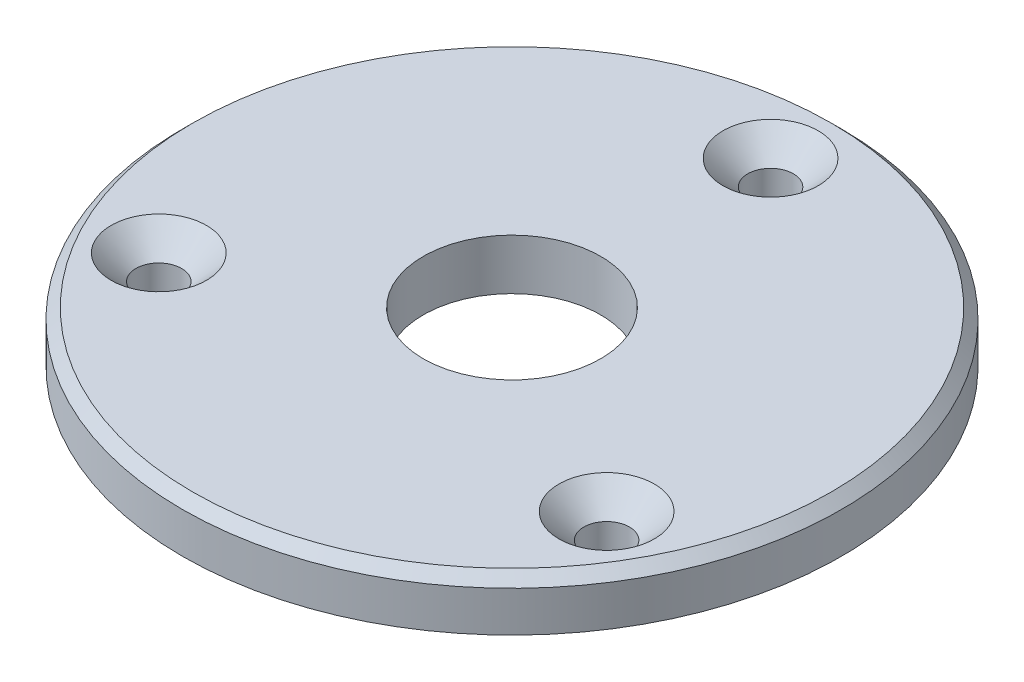
ISO-10303-21;
HEADER;
FILE_DESCRIPTION(('STEP AP214'),'2;1');
FILE_NAME('part.step','',(''),(''),'','','');
FILE_SCHEMA(('AUTOMOTIVE_DESIGN { 1 0 10303 214 1 1 1 1 }'));
ENDSEC;
DATA;
#1=APPLICATION_CONTEXT('core data for automotive mechanical design processes');
#2=APPLICATION_PROTOCOL_DEFINITION('international standard','automotive_design',2000,#1);
#3=PRODUCT_CONTEXT('',#1,'mechanical');
#4=PRODUCT('Part','Part','',(#3));
#5=PRODUCT_RELATED_PRODUCT_CATEGORY('part','',(#4));
#6=PRODUCT_DEFINITION_FORMATION('','',#4);
#7=PRODUCT_DEFINITION_CONTEXT('part definition',#1,'design');
#8=PRODUCT_DEFINITION('design','',#6,#7);
#9=PRODUCT_DEFINITION_SHAPE('','',#8);
#10=(LENGTH_UNIT() NAMED_UNIT(*) SI_UNIT(.MILLI.,.METRE.));
#11=(NAMED_UNIT(*) PLANE_ANGLE_UNIT() SI_UNIT($,.RADIAN.));
#12=(NAMED_UNIT(*) SI_UNIT($,.STERADIAN.) SOLID_ANGLE_UNIT());
#13=UNCERTAINTY_MEASURE_WITH_UNIT(LENGTH_MEASURE(1.E-05),#10,'distance_accuracy_value','');
#14=(GEOMETRIC_REPRESENTATION_CONTEXT(3) GLOBAL_UNCERTAINTY_ASSIGNED_CONTEXT((#13)) GLOBAL_UNIT_ASSIGNED_CONTEXT((#10,
#11,#12)) REPRESENTATION_CONTEXT('',''));
#15=CARTESIAN_POINT('',(0.,0.,0.));
#16=DIRECTION('',(0.,0.,1.));
#17=DIRECTION('',(1.,0.,0.));
#18=AXIS2_PLACEMENT_3D('',#15,#16,#17);
#19=CARTESIAN_POINT('',(0.,5.,0.));
#20=DIRECTION('',(0.,-1.,0.));
#21=DIRECTION('',(0.,0.,-1.));
#22=AXIS2_PLACEMENT_3D('',#19,#20,#21);
#23=CYLINDRICAL_SURFACE('',#22,32.5);
#24=CARTESIAN_POINT('',(0.,3.99999999999998,0.));
#25=DIRECTION('',(0.,1.,0.));
#26=DIRECTION('',(0.,0.,1.));
#27=AXIS2_PLACEMENT_3D('',#24,#25,#26);
#28=CIRCLE('',#27,32.5);
#29=CARTESIAN_POINT('',(0.,3.99999999999998,32.5));
#30=VERTEX_POINT('',#29);
#31=EDGE_CURVE('E10',#30,#30,#28,.F.);
#32=ORIENTED_EDGE('',*,*,#31,.T.);
#33=EDGE_LOOP('',(#32));
#34=FACE_BOUND('',#33,.T.);
#35=CARTESIAN_POINT('',(0.,0.,0.));
#36=DIRECTION('',(0.,1.,0.));
#37=DIRECTION('',(0.,0.,1.));
#38=AXIS2_PLACEMENT_3D('',#35,#36,#37);
#39=CIRCLE('',#38,32.5);
#40=CARTESIAN_POINT('',(0.,0.,32.5));
#41=VERTEX_POINT('',#40);
#42=EDGE_CURVE('E45',#41,#41,#39,.T.);
#43=ORIENTED_EDGE('',*,*,#42,.T.);
#44=EDGE_LOOP('',(#43));
#45=FACE_BOUND('',#44,.T.);
#46=ADVANCED_FACE('F34',(#34,#45),#23,.T.);
#47=CARTESIAN_POINT('',(0.,5.,0.));
#48=DIRECTION('',(0.,1.,0.));
#49=DIRECTION('',(0.,0.,1.));
#50=AXIS2_PLACEMENT_3D('',#47,#48,#49);
#51=PLANE('',#50);
#52=CARTESIAN_POINT('',(-22.0836477965033,5.,12.7499999999998));
#53=DIRECTION('',(0.,1.,0.));
#54=DIRECTION('',(0.,0.,1.));
#55=AXIS2_PLACEMENT_3D('',#52,#53,#54);
#56=CIRCLE('',#55,4.7);
#57=CARTESIAN_POINT('',(-22.0836477965033,5.,17.4499999999998));
#58=VERTEX_POINT('',#57);
#59=EDGE_CURVE('E81',#58,#58,#56,.T.);
#60=ORIENTED_EDGE('',*,*,#59,.F.);
#61=EDGE_LOOP('',(#60));
#62=FACE_BOUND('',#61,.T.);
#63=CARTESIAN_POINT('',(22.0836477965031,5.,12.7500000000001));
#64=DIRECTION('',(0.,1.,0.));
#65=DIRECTION('',(0.,0.,1.));
#66=AXIS2_PLACEMENT_3D('',#63,#64,#65);
#67=CIRCLE('',#66,4.7);
#68=CARTESIAN_POINT('',(22.0836477965031,5.,17.4500000000001));
#69=VERTEX_POINT('',#68);
#70=EDGE_CURVE('E72',#69,#69,#67,.T.);
#71=ORIENTED_EDGE('',*,*,#70,.F.);
#72=EDGE_LOOP('',(#71));
#73=FACE_BOUND('',#72,.T.);
#74=CARTESIAN_POINT('',(0.,5.,0.));
#75=DIRECTION('',(0.,1.,0.));
#76=DIRECTION('',(0.,0.,1.));
#77=AXIS2_PLACEMENT_3D('',#74,#75,#76);
#78=CIRCLE('',#77,8.75);
#79=CARTESIAN_POINT('',(0.,5.,8.75));
#80=VERTEX_POINT('',#79);
#81=EDGE_CURVE('E63',#80,#80,#78,.T.);
#82=ORIENTED_EDGE('',*,*,#81,.F.);
#83=EDGE_LOOP('',(#82));
#84=FACE_BOUND('',#83,.T.);
#85=CARTESIAN_POINT('',(0.,5.,-25.5));
#86=DIRECTION('',(0.,1.,0.));
#87=DIRECTION('',(0.,0.,1.));
#88=AXIS2_PLACEMENT_3D('',#85,#86,#87);
#89=CIRCLE('',#88,4.7);
#90=CARTESIAN_POINT('',(0.,5.,-20.8));
#91=VERTEX_POINT('',#90);
#92=EDGE_CURVE('E57',#91,#91,#89,.T.);
#93=ORIENTED_EDGE('',*,*,#92,.F.);
#94=EDGE_LOOP('',(#93));
#95=FACE_BOUND('',#94,.T.);
#96=CARTESIAN_POINT('',(0.,5.,0.));
#97=DIRECTION('',(0.,1.,0.));
#98=DIRECTION('',(0.,0.,1.));
#99=AXIS2_PLACEMENT_3D('',#96,#97,#98);
#100=CIRCLE('',#99,31.5);
#101=CARTESIAN_POINT('',(0.,5.,31.5));
#102=VERTEX_POINT('',#101);
#103=EDGE_CURVE('E41',#102,#102,#100,.T.);
#104=ORIENTED_EDGE('',*,*,#103,.T.);
#105=EDGE_LOOP('',(#104));
#106=FACE_BOUND('',#105,.T.);
#107=ADVANCED_FACE('F87',(#62,#73,#84,#95,#106),#51,.T.);
#108=CARTESIAN_POINT('',(0.,0.,0.));
#109=DIRECTION('',(0.,1.,0.));
#110=DIRECTION('',(0.,0.,1.));
#111=AXIS2_PLACEMENT_3D('',#108,#109,#110);
#112=PLANE('',#111);
#113=CARTESIAN_POINT('',(-22.0836477965033,0.,12.7499999999998));
#114=DIRECTION('',(0.,1.,0.));
#115=DIRECTION('',(0.,0.,1.));
#116=AXIS2_PLACEMENT_3D('',#113,#114,#115);
#117=CIRCLE('',#116,2.25);
#118=CARTESIAN_POINT('',(-22.0836477965033,0.,14.9999999999998));
#119=VERTEX_POINT('',#118);
#120=EDGE_CURVE('E75',#119,#119,#117,.T.);
#121=ORIENTED_EDGE('',*,*,#120,.T.);
#122=EDGE_LOOP('',(#121));
#123=FACE_BOUND('',#122,.T.);
#124=CARTESIAN_POINT('',(22.0836477965031,0.,12.7500000000001));
#125=DIRECTION('',(0.,1.,0.));
#126=DIRECTION('',(0.,0.,1.));
#127=AXIS2_PLACEMENT_3D('',#124,#125,#126);
#128=CIRCLE('',#127,2.25);
#129=CARTESIAN_POINT('',(22.0836477965031,0.,15.0000000000001));
#130=VERTEX_POINT('',#129);
#131=EDGE_CURVE('E66',#130,#130,#128,.T.);
#132=ORIENTED_EDGE('',*,*,#131,.T.);
#133=EDGE_LOOP('',(#132));
#134=FACE_BOUND('',#133,.T.);
#135=CARTESIAN_POINT('',(0.,0.,0.));
#136=DIRECTION('',(0.,1.,0.));
#137=DIRECTION('',(0.,0.,1.));
#138=AXIS2_PLACEMENT_3D('',#135,#136,#137);
#139=CIRCLE('',#138,8.75);
#140=CARTESIAN_POINT('',(0.,0.,8.75));
#141=VERTEX_POINT('',#140);
#142=EDGE_CURVE('E60',#141,#141,#139,.T.);
#143=ORIENTED_EDGE('',*,*,#142,.T.);
#144=EDGE_LOOP('',(#143));
#145=FACE_BOUND('',#144,.T.);
#146=CARTESIAN_POINT('',(0.,0.,-25.5));
#147=DIRECTION('',(0.,1.,0.));
#148=DIRECTION('',(0.,0.,1.));
#149=AXIS2_PLACEMENT_3D('',#146,#147,#148);
#150=CIRCLE('',#149,2.25);
#151=CARTESIAN_POINT('',(0.,0.,-23.25));
#152=VERTEX_POINT('',#151);
#153=EDGE_CURVE('E49',#152,#152,#150,.T.);
#154=ORIENTED_EDGE('',*,*,#153,.T.);
#155=EDGE_LOOP('',(#154));
#156=FACE_BOUND('',#155,.T.);
#157=ORIENTED_EDGE('',*,*,#42,.F.);
#158=EDGE_LOOP('',(#157));
#159=FACE_BOUND('',#158,.T.);
#160=ADVANCED_FACE('F90',(#123,#134,#145,#156,#159),#112,.F.);
#161=CARTESIAN_POINT('',(0.,5.,0.));
#162=DIRECTION('',(0.,-1.,0.));
#163=DIRECTION('',(0.,0.,-1.));
#164=AXIS2_PLACEMENT_3D('',#161,#162,#163);
#165=CONICAL_SURFACE('',#164,31.5,0.785398163397445);
#166=ORIENTED_EDGE('',*,*,#31,.F.);
#167=EDGE_LOOP('',(#166));
#168=FACE_BOUND('',#167,.T.);
#169=ORIENTED_EDGE('',*,*,#103,.F.);
#170=EDGE_LOOP('',(#169));
#171=FACE_BOUND('',#170,.T.);
#172=ADVANCED_FACE('F36',(#168,#171),#165,.T.);
#173=CARTESIAN_POINT('',(0.,5.,-25.5));
#174=DIRECTION('',(0.,1.,0.));
#175=DIRECTION('',(0.,0.,1.));
#176=AXIS2_PLACEMENT_3D('',#173,#174,#175);
#177=CYLINDRICAL_SURFACE('',#176,2.25);
#178=ORIENTED_EDGE('',*,*,#153,.F.);
#179=EDGE_LOOP('',(#178));
#180=FACE_BOUND('',#179,.T.);
#181=CARTESIAN_POINT('',(0.,2.55,-25.5));
#182=DIRECTION('',(0.,1.,0.));
#183=DIRECTION('',(0.,0.,1.));
#184=AXIS2_PLACEMENT_3D('',#181,#182,#183);
#185=CIRCLE('',#184,2.25);
#186=CARTESIAN_POINT('',(0.,2.55,-23.25));
#187=VERTEX_POINT('',#186);
#188=EDGE_CURVE('E54',#187,#187,#185,.T.);
#189=ORIENTED_EDGE('',*,*,#188,.T.);
#190=EDGE_LOOP('',(#189));
#191=FACE_BOUND('',#190,.T.);
#192=ADVANCED_FACE('F101',(#180,#191),#177,.F.);
#193=CARTESIAN_POINT('',(0.,5.,-25.5));
#194=DIRECTION('',(0.,1.,0.));
#195=DIRECTION('',(0.,0.,1.));
#196=AXIS2_PLACEMENT_3D('',#193,#194,#195);
#197=CONICAL_SURFACE('',#196,4.7,0.785398163397448);
#198=ORIENTED_EDGE('',*,*,#188,.F.);
#199=EDGE_LOOP('',(#198));
#200=FACE_BOUND('',#199,.T.);
#201=ORIENTED_EDGE('',*,*,#92,.T.);
#202=EDGE_LOOP('',(#201));
#203=FACE_BOUND('',#202,.T.);
#204=ADVANCED_FACE('F98',(#200,#203),#197,.F.);
#205=CARTESIAN_POINT('',(0.,5.,0.));
#206=DIRECTION('',(0.,1.,0.));
#207=DIRECTION('',(0.,0.,1.));
#208=AXIS2_PLACEMENT_3D('',#205,#206,#207);
#209=CYLINDRICAL_SURFACE('',#208,8.75);
#210=ORIENTED_EDGE('',*,*,#142,.F.);
#211=EDGE_LOOP('',(#210));
#212=FACE_BOUND('',#211,.T.);
#213=ORIENTED_EDGE('',*,*,#81,.T.);
#214=EDGE_LOOP('',(#213));
#215=FACE_BOUND('',#214,.T.);
#216=ADVANCED_FACE('F100',(#212,#215),#209,.F.);
#217=CARTESIAN_POINT('',(22.0836477965031,5.,12.7500000000001));
#218=DIRECTION('',(0.,1.,0.));
#219=DIRECTION('',(0.,0.,1.));
#220=AXIS2_PLACEMENT_3D('',#217,#218,#219);
#221=CYLINDRICAL_SURFACE('',#220,2.25);
#222=ORIENTED_EDGE('',*,*,#131,.F.);
#223=EDGE_LOOP('',(#222));
#224=FACE_BOUND('',#223,.T.);
#225=CARTESIAN_POINT('',(22.0836477965031,2.55,12.7500000000001));
#226=DIRECTION('',(0.,1.,0.));
#227=DIRECTION('',(0.,0.,1.));
#228=AXIS2_PLACEMENT_3D('',#225,#226,#227);
#229=CIRCLE('',#228,2.25);
#230=CARTESIAN_POINT('',(22.0836477965031,2.55,15.0000000000001));
#231=VERTEX_POINT('',#230);
#232=EDGE_CURVE('E69',#231,#231,#229,.T.);
#233=ORIENTED_EDGE('',*,*,#232,.T.);
#234=EDGE_LOOP('',(#233));
#235=FACE_BOUND('',#234,.T.);
#236=ADVANCED_FACE('F108',(#224,#235),#221,.F.);
#237=CARTESIAN_POINT('',(22.0836477965031,5.,12.7500000000001));
#238=DIRECTION('',(0.,1.,0.));
#239=DIRECTION('',(0.,0.,1.));
#240=AXIS2_PLACEMENT_3D('',#237,#238,#239);
#241=CONICAL_SURFACE('',#240,4.7,0.785398163397449);
#242=ORIENTED_EDGE('',*,*,#232,.F.);
#243=EDGE_LOOP('',(#242));
#244=FACE_BOUND('',#243,.T.);
#245=ORIENTED_EDGE('',*,*,#70,.T.);
#246=EDGE_LOOP('',(#245));
#247=FACE_BOUND('',#246,.T.);
#248=ADVANCED_FACE('F139',(#244,#247),#241,.F.);
#249=CARTESIAN_POINT('',(-22.0836477965033,5.,12.7499999999998));
#250=DIRECTION('',(0.,1.,0.));
#251=DIRECTION('',(0.,0.,1.));
#252=AXIS2_PLACEMENT_3D('',#249,#250,#251);
#253=CYLINDRICAL_SURFACE('',#252,2.25);
#254=ORIENTED_EDGE('',*,*,#120,.F.);
#255=EDGE_LOOP('',(#254));
#256=FACE_BOUND('',#255,.T.);
#257=CARTESIAN_POINT('',(-22.0836477965033,2.55,12.7499999999998));
#258=DIRECTION('',(0.,1.,0.));
#259=DIRECTION('',(0.,0.,1.));
#260=AXIS2_PLACEMENT_3D('',#257,#258,#259);
#261=CIRCLE('',#260,2.25);
#262=CARTESIAN_POINT('',(-22.0836477965033,2.55,14.9999999999998));
#263=VERTEX_POINT('',#262);
#264=EDGE_CURVE('E78',#263,#263,#261,.T.);
#265=ORIENTED_EDGE('',*,*,#264,.T.);
#266=EDGE_LOOP('',(#265));
#267=FACE_BOUND('',#266,.T.);
#268=ADVANCED_FACE('F145',(#256,#267),#253,.F.);
#269=CARTESIAN_POINT('',(-22.0836477965033,5.,12.7499999999998));
#270=DIRECTION('',(0.,1.,0.));
#271=DIRECTION('',(0.,0.,1.));
#272=AXIS2_PLACEMENT_3D('',#269,#270,#271);
#273=CONICAL_SURFACE('',#272,4.7,0.785398163397449);
#274=ORIENTED_EDGE('',*,*,#264,.F.);
#275=EDGE_LOOP('',(#274));
#276=FACE_BOUND('',#275,.T.);
#277=ORIENTED_EDGE('',*,*,#59,.T.);
#278=EDGE_LOOP('',(#277));
#279=FACE_BOUND('',#278,.T.);
#280=ADVANCED_FACE('F85',(#276,#279),#273,.F.);
#281=CLOSED_SHELL('',(#46,#107,#160,#172,#192,#204,#216,#236,#248,#268,#280));
#282=MANIFOLD_SOLID_BREP('B2',#281);
#283=ADVANCED_BREP_SHAPE_REPRESENTATION('',(#18,#282),#14);
#284=SHAPE_DEFINITION_REPRESENTATION(#9,#283);
ENDSEC;
END-ISO-10303-21;
